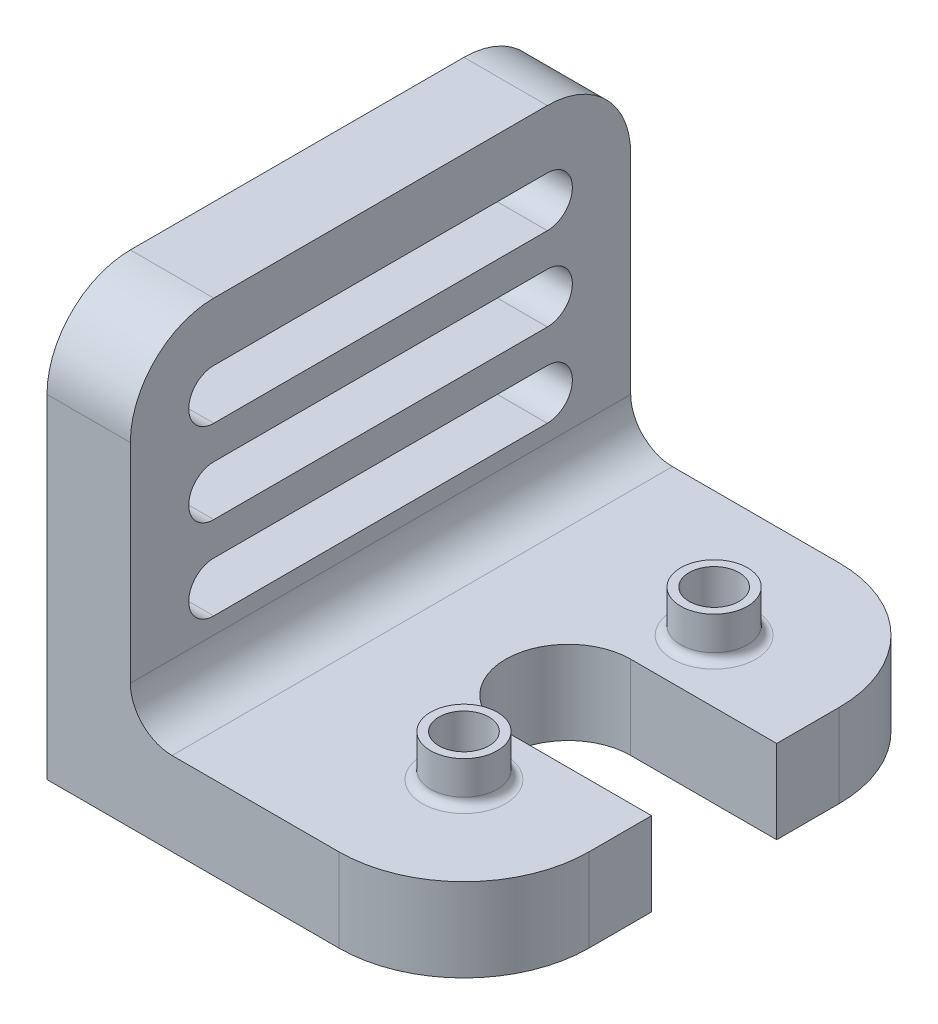
ISO-10303-21;
HEADER;
FILE_DESCRIPTION(('STEP AP214'),'2;1');
FILE_NAME('part.step','',(''),(''),'','','');
FILE_SCHEMA(('AUTOMOTIVE_DESIGN { 1 0 10303 214 1 1 1 1 }'));
ENDSEC;
DATA;
#1=APPLICATION_CONTEXT('core data for automotive mechanical design processes');
#2=APPLICATION_PROTOCOL_DEFINITION('international standard','automotive_design',2000,#1);
#3=PRODUCT_CONTEXT('',#1,'mechanical');
#4=PRODUCT('Part','Part','',(#3));
#5=PRODUCT_RELATED_PRODUCT_CATEGORY('part','',(#4));
#6=PRODUCT_DEFINITION_FORMATION('','',#4);
#7=PRODUCT_DEFINITION_CONTEXT('part definition',#1,'design');
#8=PRODUCT_DEFINITION('design','',#6,#7);
#9=PRODUCT_DEFINITION_SHAPE('','',#8);
#10=(LENGTH_UNIT() NAMED_UNIT(*) SI_UNIT(.MILLI.,.METRE.));
#11=(NAMED_UNIT(*) PLANE_ANGLE_UNIT() SI_UNIT($,.RADIAN.));
#12=(NAMED_UNIT(*) SI_UNIT($,.STERADIAN.) SOLID_ANGLE_UNIT());
#13=UNCERTAINTY_MEASURE_WITH_UNIT(LENGTH_MEASURE(1.E-05),#10,'distance_accuracy_value','');
#14=(GEOMETRIC_REPRESENTATION_CONTEXT(3) GLOBAL_UNCERTAINTY_ASSIGNED_CONTEXT((#13)) GLOBAL_UNIT_ASSIGNED_CONTEXT((#10,
#11,#12)) REPRESENTATION_CONTEXT('',''));
#15=CARTESIAN_POINT('',(0.,0.,0.));
#16=DIRECTION('',(0.,0.,1.));
#17=DIRECTION('',(1.,0.,0.));
#18=AXIS2_PLACEMENT_3D('',#15,#16,#17);
#19=CARTESIAN_POINT('',(100.,0.,60.));
#20=DIRECTION('',(-1.,0.,0.));
#21=DIRECTION('',(0.,0.,1.));
#22=AXIS2_PLACEMENT_3D('',#19,#20,#21);
#23=PLANE('',#22);
#24=DIRECTION('',(0.,1.,0.));
#25=VECTOR('',#24,1.);
#26=CARTESIAN_POINT('',(100.,-0.001000000000001,15.));
#27=LINE('',#26,#25);
#28=CARTESIAN_POINT('',(100.,0.,15.));
#29=VERTEX_POINT('',#28);
#30=CARTESIAN_POINT('',(100.,20.,15.));
#31=VERTEX_POINT('',#30);
#32=EDGE_CURVE('E250',#29,#31,#27,.T.);
#33=ORIENTED_EDGE('',*,*,#32,.T.);
#34=DIRECTION('',(0.,0.,-1.));
#35=VECTOR('',#34,1.);
#36=CARTESIAN_POINT('',(100.,20.,60.));
#37=LINE('',#36,#35);
#38=CARTESIAN_POINT('',(100.,20.,30.));
#39=VERTEX_POINT('',#38);
#40=EDGE_CURVE('E372',#39,#31,#37,.T.);
#41=ORIENTED_EDGE('',*,*,#40,.F.);
#42=DIRECTION('',(0.,1.,0.));
#43=VECTOR('',#42,1.);
#44=CARTESIAN_POINT('',(100.,0.,30.));
#45=LINE('',#44,#43);
#46=CARTESIAN_POINT('',(100.,0.,30.));
#47=VERTEX_POINT('',#46);
#48=EDGE_CURVE('E401',#39,#47,#45,.F.);
#49=ORIENTED_EDGE('',*,*,#48,.T.);
#50=DIRECTION('',(0.,0.,-1.));
#51=VECTOR('',#50,1.);
#52=CARTESIAN_POINT('',(100.,0.,60.));
#53=LINE('',#52,#51);
#54=EDGE_CURVE('E375',#47,#29,#53,.T.);
#55=ORIENTED_EDGE('',*,*,#54,.T.);
#56=EDGE_LOOP('',(#33,#41,#49,#55));
#57=FACE_BOUND('',#56,.T.);
#58=ADVANCED_FACE('F37',(#57),#23,.F.);
#59=CARTESIAN_POINT('',(0.,100.,60.));
#60=DIRECTION('',(1.,0.,0.));
#61=DIRECTION('',(0.,1.,0.));
#62=AXIS2_PLACEMENT_3D('',#59,#60,#61);
#63=PLANE('',#62);
#64=DIRECTION('',(0.,0.,-1.));
#65=VECTOR('',#64,1.);
#66=CARTESIAN_POINT('',(0.,86.,40.));
#67=LINE('',#66,#65);
#68=CARTESIAN_POINT('',(0.,86.,40.));
#69=VERTEX_POINT('',#68);
#70=CARTESIAN_POINT('',(0.,86.,-40.));
#71=VERTEX_POINT('',#70);
#72=EDGE_CURVE('E255',#69,#71,#67,.T.);
#73=ORIENTED_EDGE('',*,*,#72,.F.);
#74=CARTESIAN_POINT('',(0.,80.,40.));
#75=DIRECTION('',(1.,0.,0.));
#76=DIRECTION('',(0.,1.,0.));
#77=AXIS2_PLACEMENT_3D('',#74,#75,#76);
#78=CIRCLE('',#77,6.00000000000001);
#79=CARTESIAN_POINT('',(0.,74.,40.));
#80=VERTEX_POINT('',#79);
#81=EDGE_CURVE('E259',#80,#69,#78,.F.);
#82=ORIENTED_EDGE('',*,*,#81,.F.);
#83=DIRECTION('',(0.,0.,1.));
#84=VECTOR('',#83,1.);
#85=CARTESIAN_POINT('',(0.,74.,40.));
#86=LINE('',#85,#84);
#87=CARTESIAN_POINT('',(0.,74.,-40.));
#88=VERTEX_POINT('',#87);
#89=EDGE_CURVE('E276',#88,#80,#86,.T.);
#90=ORIENTED_EDGE('',*,*,#89,.F.);
#91=CARTESIAN_POINT('',(0.,80.,-40.));
#92=DIRECTION('',(1.,0.,0.));
#93=DIRECTION('',(0.,1.,0.));
#94=AXIS2_PLACEMENT_3D('',#91,#92,#93);
#95=CIRCLE('',#94,6.00000000000001);
#96=EDGE_CURVE('E60',#71,#88,#95,.F.);
#97=ORIENTED_EDGE('',*,*,#96,.F.);
#98=EDGE_LOOP('',(#73,#82,#90,#97));
#99=FACE_BOUND('',#98,.T.);
#100=DIRECTION('',(0.,0.,-1.));
#101=VECTOR('',#100,1.);
#102=CARTESIAN_POINT('',(0.,66.,40.));
#103=LINE('',#102,#101);
#104=CARTESIAN_POINT('',(0.,66.,40.));
#105=VERTEX_POINT('',#104);
#106=CARTESIAN_POINT('',(0.,66.,-40.));
#107=VERTEX_POINT('',#106);
#108=EDGE_CURVE('E313',#105,#107,#103,.T.);
#109=ORIENTED_EDGE('',*,*,#108,.F.);
#110=CARTESIAN_POINT('',(0.,60.,40.));
#111=DIRECTION('',(1.,0.,0.));
#112=DIRECTION('',(0.,1.,0.));
#113=AXIS2_PLACEMENT_3D('',#110,#111,#112);
#114=CIRCLE('',#113,6.00000000000001);
#115=CARTESIAN_POINT('',(0.,54.,40.));
#116=VERTEX_POINT('',#115);
#117=EDGE_CURVE('E310',#116,#105,#114,.F.);
#118=ORIENTED_EDGE('',*,*,#117,.F.);
#119=DIRECTION('',(0.,0.,1.));
#120=VECTOR('',#119,1.);
#121=CARTESIAN_POINT('',(0.,54.,40.));
#122=LINE('',#121,#120);
#123=CARTESIAN_POINT('',(0.,54.,-40.));
#124=VERTEX_POINT('',#123);
#125=EDGE_CURVE('E286',#124,#116,#122,.T.);
#126=ORIENTED_EDGE('',*,*,#125,.F.);
#127=CARTESIAN_POINT('',(0.,60.,-40.));
#128=DIRECTION('',(1.,0.,0.));
#129=DIRECTION('',(0.,1.,0.));
#130=AXIS2_PLACEMENT_3D('',#127,#128,#129);
#131=CIRCLE('',#130,6.00000000000001);
#132=EDGE_CURVE('E256',#107,#124,#131,.F.);
#133=ORIENTED_EDGE('',*,*,#132,.F.);
#134=EDGE_LOOP('',(#109,#118,#126,#133));
#135=FACE_BOUND('',#134,.T.);
#136=DIRECTION('',(0.,0.,-1.));
#137=VECTOR('',#136,1.);
#138=CARTESIAN_POINT('',(0.,46.,40.));
#139=LINE('',#138,#137);
#140=CARTESIAN_POINT('',(0.,46.,40.));
#141=VERTEX_POINT('',#140);
#142=CARTESIAN_POINT('',(0.,46.,-40.));
#143=VERTEX_POINT('',#142);
#144=EDGE_CURVE('E342',#141,#143,#139,.T.);
#145=ORIENTED_EDGE('',*,*,#144,.F.);
#146=CARTESIAN_POINT('',(0.,40.,40.));
#147=DIRECTION('',(1.,0.,0.));
#148=DIRECTION('',(0.,1.,0.));
#149=AXIS2_PLACEMENT_3D('',#146,#147,#148);
#150=CIRCLE('',#149,6.);
#151=CARTESIAN_POINT('',(0.,34.,40.));
#152=VERTEX_POINT('',#151);
#153=EDGE_CURVE('E339',#152,#141,#150,.F.);
#154=ORIENTED_EDGE('',*,*,#153,.F.);
#155=DIRECTION('',(0.,0.,1.));
#156=VECTOR('',#155,1.);
#157=CARTESIAN_POINT('',(0.,34.,40.));
#158=LINE('',#157,#156);
#159=CARTESIAN_POINT('',(0.,34.,-40.));
#160=VERTEX_POINT('',#159);
#161=EDGE_CURVE('E231',#160,#152,#158,.T.);
#162=ORIENTED_EDGE('',*,*,#161,.F.);
#163=CARTESIAN_POINT('',(0.,40.,-40.));
#164=DIRECTION('',(1.,0.,0.));
#165=DIRECTION('',(0.,1.,0.));
#166=AXIS2_PLACEMENT_3D('',#163,#164,#165);
#167=CIRCLE('',#166,6.);
#168=EDGE_CURVE('E290',#143,#160,#167,.F.);
#169=ORIENTED_EDGE('',*,*,#168,.F.);
#170=EDGE_LOOP('',(#145,#154,#162,#169));
#171=FACE_BOUND('',#170,.T.);
#172=DIRECTION('',(0.,0.,-1.));
#173=VECTOR('',#172,1.);
#174=CARTESIAN_POINT('',(0.,100.,60.));
#175=LINE('',#174,#173);
#176=CARTESIAN_POINT('',(0.,100.,40.));
#177=VERTEX_POINT('',#176);
#178=CARTESIAN_POINT('',(0.,100.,-40.));
#179=VERTEX_POINT('',#178);
#180=EDGE_CURVE('E357',#177,#179,#175,.T.);
#181=ORIENTED_EDGE('',*,*,#180,.T.);
#182=CARTESIAN_POINT('',(0.,80.,-40.));
#183=DIRECTION('',(1.,0.,0.));
#184=DIRECTION('',(0.,1.,0.));
#185=AXIS2_PLACEMENT_3D('',#182,#183,#184);
#186=CIRCLE('',#185,20.);
#187=CARTESIAN_POINT('',(0.,80.,-60.));
#188=VERTEX_POINT('',#187);
#189=EDGE_CURVE('E388',#179,#188,#186,.F.);
#190=ORIENTED_EDGE('',*,*,#189,.T.);
#191=DIRECTION('',(0.,-1.,0.));
#192=VECTOR('',#191,1.);
#193=CARTESIAN_POINT('',(0.,100.,-60.));
#194=LINE('',#193,#192);
#195=CARTESIAN_POINT('',(0.,0.,-60.));
#196=VERTEX_POINT('',#195);
#197=EDGE_CURVE('E285',#188,#196,#194,.T.);
#198=ORIENTED_EDGE('',*,*,#197,.T.);
#199=DIRECTION('',(0.,0.,-1.));
#200=VECTOR('',#199,1.);
#201=CARTESIAN_POINT('',(0.,0.,60.));
#202=LINE('',#201,#200);
#203=CARTESIAN_POINT('',(0.,0.,60.));
#204=VERTEX_POINT('',#203);
#205=EDGE_CURVE('E378',#204,#196,#202,.T.);
#206=ORIENTED_EDGE('',*,*,#205,.F.);
#207=DIRECTION('',(0.,-1.,0.));
#208=VECTOR('',#207,1.);
#209=CARTESIAN_POINT('',(0.,100.,60.));
#210=LINE('',#209,#208);
#211=CARTESIAN_POINT('',(0.,80.,60.));
#212=VERTEX_POINT('',#211);
#213=EDGE_CURVE('E346',#212,#204,#210,.T.);
#214=ORIENTED_EDGE('',*,*,#213,.F.);
#215=CARTESIAN_POINT('',(0.,80.,40.));
#216=DIRECTION('',(1.,0.,0.));
#217=DIRECTION('',(0.,1.,0.));
#218=AXIS2_PLACEMENT_3D('',#215,#216,#217);
#219=CIRCLE('',#218,20.);
#220=EDGE_CURVE('E386',#212,#177,#219,.F.);
#221=ORIENTED_EDGE('',*,*,#220,.T.);
#222=EDGE_LOOP('',(#181,#190,#198,#206,#214,#221));
#223=FACE_BOUND('',#222,.T.);
#224=ADVANCED_FACE('F493',(#99,#135,#171,#223),#63,.F.);
#225=CARTESIAN_POINT('',(0.,0.,60.));
#226=DIRECTION('',(0.,1.,0.));
#227=DIRECTION('',(0.,0.,1.));
#228=AXIS2_PLACEMENT_3D('',#225,#226,#227);
#229=PLANE('',#228);
#230=CARTESIAN_POINT('',(100.,0.,-15.));
#231=VERTEX_POINT('',#230);
#232=CARTESIAN_POINT('',(100.,0.,-30.));
#233=VERTEX_POINT('',#232);
#234=EDGE_CURVE('E237',#231,#233,#53,.T.);
#235=ORIENTED_EDGE('',*,*,#234,.F.);
#236=DIRECTION('',(1.,0.,0.));
#237=VECTOR('',#236,1.);
#238=CARTESIAN_POINT('',(0.,0.,-15.));
#239=LINE('',#238,#237);
#240=CARTESIAN_POINT('',(65.,0.,-15.));
#241=VERTEX_POINT('',#240);
#242=EDGE_CURVE('E217',#241,#231,#239,.T.);
#243=ORIENTED_EDGE('',*,*,#242,.F.);
#244=CARTESIAN_POINT('',(65.,0.,0.));
#245=DIRECTION('',(0.,1.,0.));
#246=DIRECTION('',(0.,0.,1.));
#247=AXIS2_PLACEMENT_3D('',#244,#245,#246);
#248=CIRCLE('',#247,15.);
#249=CARTESIAN_POINT('',(65.,0.,15.));
#250=VERTEX_POINT('',#249);
#251=EDGE_CURVE('E226',#250,#241,#248,.F.);
#252=ORIENTED_EDGE('',*,*,#251,.F.);
#253=DIRECTION('',(1.,0.,0.));
#254=VECTOR('',#253,1.);
#255=CARTESIAN_POINT('',(0.,0.,15.));
#256=LINE('',#255,#254);
#257=EDGE_CURVE('E238',#250,#29,#256,.T.);
#258=ORIENTED_EDGE('',*,*,#257,.T.);
#259=ORIENTED_EDGE('',*,*,#54,.F.);
#260=CARTESIAN_POINT('',(70.,0.,30.));
#261=DIRECTION('',(0.,1.,0.));
#262=DIRECTION('',(0.,0.,1.));
#263=AXIS2_PLACEMENT_3D('',#260,#261,#262);
#264=CIRCLE('',#263,30.);
#265=CARTESIAN_POINT('',(70.,0.,60.));
#266=VERTEX_POINT('',#265);
#267=EDGE_CURVE('E412',#47,#266,#264,.F.);
#268=ORIENTED_EDGE('',*,*,#267,.T.);
#269=DIRECTION('',(1.,0.,0.));
#270=VECTOR('',#269,1.);
#271=CARTESIAN_POINT('',(0.,0.,60.));
#272=LINE('',#271,#270);
#273=EDGE_CURVE('E348',#204,#266,#272,.T.);
#274=ORIENTED_EDGE('',*,*,#273,.F.);
#275=ORIENTED_EDGE('',*,*,#205,.T.);
#276=DIRECTION('',(1.,0.,0.));
#277=VECTOR('',#276,1.);
#278=CARTESIAN_POINT('',(0.,0.,-60.));
#279=LINE('',#278,#277);
#280=CARTESIAN_POINT('',(70.,0.,-60.));
#281=VERTEX_POINT('',#280);
#282=EDGE_CURVE('E359',#196,#281,#279,.T.);
#283=ORIENTED_EDGE('',*,*,#282,.T.);
#284=CARTESIAN_POINT('',(70.,0.,-30.));
#285=DIRECTION('',(0.,1.,0.));
#286=DIRECTION('',(0.,0.,1.));
#287=AXIS2_PLACEMENT_3D('',#284,#285,#286);
#288=CIRCLE('',#287,30.);
#289=EDGE_CURVE('E414',#281,#233,#288,.F.);
#290=ORIENTED_EDGE('',*,*,#289,.T.);
#291=EDGE_LOOP('',(#235,#243,#252,#258,#259,#268,#274,#275,#283,#290));
#292=FACE_BOUND('',#291,.T.);
#293=ADVANCED_FACE('F235',(#292),#229,.F.);
#294=CARTESIAN_POINT('',(100.,20.,-15.));
#295=VERTEX_POINT('',#294);
#296=CARTESIAN_POINT('',(100.,20.,-30.));
#297=VERTEX_POINT('',#296);
#298=EDGE_CURVE('E371',#295,#297,#37,.T.);
#299=ORIENTED_EDGE('',*,*,#298,.F.);
#300=DIRECTION('',(0.,1.,0.));
#301=VECTOR('',#300,1.);
#302=CARTESIAN_POINT('',(100.,-0.001000000000001,-15.));
#303=LINE('',#302,#301);
#304=EDGE_CURVE('E232',#231,#295,#303,.T.);
#305=ORIENTED_EDGE('',*,*,#304,.F.);
#306=ORIENTED_EDGE('',*,*,#234,.T.);
#307=DIRECTION('',(0.,1.,0.));
#308=VECTOR('',#307,1.);
#309=CARTESIAN_POINT('',(100.,0.,-30.));
#310=LINE('',#309,#308);
#311=EDGE_CURVE('E403',#233,#297,#310,.T.);
#312=ORIENTED_EDGE('',*,*,#311,.T.);
#313=EDGE_LOOP('',(#299,#305,#306,#312));
#314=FACE_BOUND('',#313,.T.);
#315=ADVANCED_FACE('F496',(#314),#23,.F.);
#316=CARTESIAN_POINT('',(100.,20.,60.));
#317=DIRECTION('',(0.,-1.,0.));
#318=DIRECTION('',(1.,0.,0.));
#319=AXIS2_PLACEMENT_3D('',#316,#317,#318);
#320=PLANE('',#319);
#321=CARTESIAN_POINT('',(70.,20.,30.));
#322=DIRECTION('',(0.,-1.,0.));
#323=DIRECTION('',(1.,0.,0.));
#324=AXIS2_PLACEMENT_3D('',#321,#322,#323);
#325=CIRCLE('',#324,10.);
#326=CARTESIAN_POINT('',(80.,20.,30.));
#327=VERTEX_POINT('',#326);
#328=EDGE_CURVE('E45',#327,#327,#325,.T.);
#329=ORIENTED_EDGE('',*,*,#328,.T.);
#330=EDGE_LOOP('',(#329));
#331=FACE_BOUND('',#330,.T.);
#332=CARTESIAN_POINT('',(70.,20.,-30.));
#333=DIRECTION('',(0.,-1.,0.));
#334=DIRECTION('',(1.,0.,0.));
#335=AXIS2_PLACEMENT_3D('',#332,#333,#334);
#336=CIRCLE('',#335,10.);
#337=CARTESIAN_POINT('',(80.,20.,-30.));
#338=VERTEX_POINT('',#337);
#339=EDGE_CURVE('E431',#338,#338,#336,.T.);
#340=ORIENTED_EDGE('',*,*,#339,.T.);
#341=EDGE_LOOP('',(#340));
#342=FACE_BOUND('',#341,.T.);
#343=CARTESIAN_POINT('',(65.,20.,0.));
#344=DIRECTION('',(0.,1.,0.));
#345=DIRECTION('',(-1.,0.,0.));
#346=AXIS2_PLACEMENT_3D('',#343,#344,#345);
#347=CIRCLE('',#346,15.);
#348=CARTESIAN_POINT('',(65.,20.,-15.));
#349=VERTEX_POINT('',#348);
#350=CARTESIAN_POINT('',(65.,20.,15.));
#351=VERTEX_POINT('',#350);
#352=EDGE_CURVE('E240',#349,#351,#347,.T.);
#353=ORIENTED_EDGE('',*,*,#352,.F.);
#354=DIRECTION('',(-1.,0.,0.));
#355=VECTOR('',#354,1.);
#356=CARTESIAN_POINT('',(0.,20.,-15.));
#357=LINE('',#356,#355);
#358=EDGE_CURVE('E52',#295,#349,#357,.T.);
#359=ORIENTED_EDGE('',*,*,#358,.F.);
#360=ORIENTED_EDGE('',*,*,#298,.T.);
#361=CARTESIAN_POINT('',(70.,20.,-30.));
#362=DIRECTION('',(0.,-1.,0.));
#363=DIRECTION('',(1.,0.,0.));
#364=AXIS2_PLACEMENT_3D('',#361,#362,#363);
#365=CIRCLE('',#364,30.);
#366=CARTESIAN_POINT('',(70.,20.,-60.));
#367=VERTEX_POINT('',#366);
#368=EDGE_CURVE('E408',#297,#367,#365,.F.);
#369=ORIENTED_EDGE('',*,*,#368,.T.);
#370=DIRECTION('',(-1.,0.,0.));
#371=VECTOR('',#370,1.);
#372=CARTESIAN_POINT('',(100.,20.,-60.));
#373=LINE('',#372,#371);
#374=CARTESIAN_POINT('',(30.,20.,-60.));
#375=VERTEX_POINT('',#374);
#376=EDGE_CURVE('E362',#367,#375,#373,.T.);
#377=ORIENTED_EDGE('',*,*,#376,.T.);
#378=DIRECTION('',(0.,0.,-1.));
#379=VECTOR('',#378,1.);
#380=CARTESIAN_POINT('',(30.,20.,60.));
#381=LINE('',#380,#379);
#382=CARTESIAN_POINT('',(30.,20.,60.));
#383=VERTEX_POINT('',#382);
#384=EDGE_CURVE('E422',#375,#383,#381,.F.);
#385=ORIENTED_EDGE('',*,*,#384,.T.);
#386=DIRECTION('',(-1.,0.,0.));
#387=VECTOR('',#386,1.);
#388=CARTESIAN_POINT('',(100.,20.,60.));
#389=LINE('',#388,#387);
#390=CARTESIAN_POINT('',(70.,20.,60.));
#391=VERTEX_POINT('',#390);
#392=EDGE_CURVE('E352',#391,#383,#389,.T.);
#393=ORIENTED_EDGE('',*,*,#392,.F.);
#394=CARTESIAN_POINT('',(70.,20.,30.));
#395=DIRECTION('',(0.,-1.,0.));
#396=DIRECTION('',(1.,0.,0.));
#397=AXIS2_PLACEMENT_3D('',#394,#395,#396);
#398=CIRCLE('',#397,30.);
#399=EDGE_CURVE('E406',#391,#39,#398,.F.);
#400=ORIENTED_EDGE('',*,*,#399,.T.);
#401=ORIENTED_EDGE('',*,*,#40,.T.);
#402=DIRECTION('',(-1.,0.,0.));
#403=VECTOR('',#402,1.);
#404=CARTESIAN_POINT('',(0.,20.,15.));
#405=LINE('',#404,#403);
#406=EDGE_CURVE('E223',#31,#351,#405,.T.);
#407=ORIENTED_EDGE('',*,*,#406,.T.);
#408=EDGE_LOOP('',(#353,#359,#360,#369,#377,#385,#393,#400,#401,#407));
#409=FACE_BOUND('',#408,.T.);
#410=ADVANCED_FACE('F436',(#331,#342,#409),#320,.F.);
#411=CARTESIAN_POINT('',(20.,20.,60.));
#412=DIRECTION('',(-1.,0.,0.));
#413=DIRECTION('',(0.,-1.,0.));
#414=AXIS2_PLACEMENT_3D('',#411,#412,#413);
#415=PLANE('',#414);
#416=DIRECTION('',(0.,0.,-1.));
#417=VECTOR('',#416,1.);
#418=CARTESIAN_POINT('',(20.,74.,40.));
#419=LINE('',#418,#417);
#420=CARTESIAN_POINT('',(20.,74.,40.));
#421=VERTEX_POINT('',#420);
#422=CARTESIAN_POINT('',(20.,74.,-40.));
#423=VERTEX_POINT('',#422);
#424=EDGE_CURVE('E264',#421,#423,#419,.T.);
#425=ORIENTED_EDGE('',*,*,#424,.F.);
#426=CARTESIAN_POINT('',(20.,80.,40.));
#427=DIRECTION('',(1.,0.,0.));
#428=DIRECTION('',(0.,1.,0.));
#429=AXIS2_PLACEMENT_3D('',#426,#427,#428);
#430=CIRCLE('',#429,6.00000000000001);
#431=CARTESIAN_POINT('',(20.,86.,40.));
#432=VERTEX_POINT('',#431);
#433=EDGE_CURVE('E262',#432,#421,#430,.T.);
#434=ORIENTED_EDGE('',*,*,#433,.F.);
#435=DIRECTION('',(0.,0.,1.));
#436=VECTOR('',#435,1.);
#437=CARTESIAN_POINT('',(20.,86.,40.));
#438=LINE('',#437,#436);
#439=CARTESIAN_POINT('',(20.,86.,-40.));
#440=VERTEX_POINT('',#439);
#441=EDGE_CURVE('E270',#440,#432,#438,.T.);
#442=ORIENTED_EDGE('',*,*,#441,.F.);
#443=CARTESIAN_POINT('',(20.,80.,-40.));
#444=DIRECTION('',(1.,0.,0.));
#445=DIRECTION('',(0.,1.,0.));
#446=AXIS2_PLACEMENT_3D('',#443,#444,#445);
#447=CIRCLE('',#446,6.00000000000001);
#448=EDGE_CURVE('E267',#423,#440,#447,.T.);
#449=ORIENTED_EDGE('',*,*,#448,.F.);
#450=EDGE_LOOP('',(#425,#434,#442,#449));
#451=FACE_BOUND('',#450,.T.);
#452=DIRECTION('',(0.,0.,-1.));
#453=VECTOR('',#452,1.);
#454=CARTESIAN_POINT('',(20.,54.,40.));
#455=LINE('',#454,#453);
#456=CARTESIAN_POINT('',(20.,54.,40.));
#457=VERTEX_POINT('',#456);
#458=CARTESIAN_POINT('',(20.,54.,-40.));
#459=VERTEX_POINT('',#458);
#460=EDGE_CURVE('E305',#457,#459,#455,.T.);
#461=ORIENTED_EDGE('',*,*,#460,.F.);
#462=CARTESIAN_POINT('',(20.,60.,40.));
#463=DIRECTION('',(1.,0.,0.));
#464=DIRECTION('',(0.,1.,0.));
#465=AXIS2_PLACEMENT_3D('',#462,#463,#464);
#466=CIRCLE('',#465,6.00000000000001);
#467=CARTESIAN_POINT('',(20.,66.,40.));
#468=VERTEX_POINT('',#467);
#469=EDGE_CURVE('E308',#468,#457,#466,.T.);
#470=ORIENTED_EDGE('',*,*,#469,.F.);
#471=DIRECTION('',(0.,0.,1.));
#472=VECTOR('',#471,1.);
#473=CARTESIAN_POINT('',(20.,66.,40.));
#474=LINE('',#473,#472);
#475=CARTESIAN_POINT('',(20.,66.,-40.));
#476=VERTEX_POINT('',#475);
#477=EDGE_CURVE('E294',#476,#468,#474,.T.);
#478=ORIENTED_EDGE('',*,*,#477,.F.);
#479=CARTESIAN_POINT('',(20.,60.,-40.));
#480=DIRECTION('',(1.,0.,0.));
#481=DIRECTION('',(0.,1.,0.));
#482=AXIS2_PLACEMENT_3D('',#479,#480,#481);
#483=CIRCLE('',#482,6.00000000000001);
#484=EDGE_CURVE('E302',#459,#476,#483,.T.);
#485=ORIENTED_EDGE('',*,*,#484,.F.);
#486=EDGE_LOOP('',(#461,#470,#478,#485));
#487=FACE_BOUND('',#486,.T.);
#488=DIRECTION('',(0.,0.,-1.));
#489=VECTOR('',#488,1.);
#490=CARTESIAN_POINT('',(20.,34.,40.));
#491=LINE('',#490,#489);
#492=CARTESIAN_POINT('',(20.,34.,40.));
#493=VERTEX_POINT('',#492);
#494=CARTESIAN_POINT('',(20.,34.,-40.));
#495=VERTEX_POINT('',#494);
#496=EDGE_CURVE('E334',#493,#495,#491,.T.);
#497=ORIENTED_EDGE('',*,*,#496,.F.);
#498=CARTESIAN_POINT('',(20.,40.,40.));
#499=DIRECTION('',(1.,0.,0.));
#500=DIRECTION('',(0.,1.,0.));
#501=AXIS2_PLACEMENT_3D('',#498,#499,#500);
#502=CIRCLE('',#501,6.);
#503=CARTESIAN_POINT('',(20.,46.,40.));
#504=VERTEX_POINT('',#503);
#505=EDGE_CURVE('E337',#504,#493,#502,.T.);
#506=ORIENTED_EDGE('',*,*,#505,.F.);
#507=DIRECTION('',(0.,0.,1.));
#508=VECTOR('',#507,1.);
#509=CARTESIAN_POINT('',(20.,46.,40.));
#510=LINE('',#509,#508);
#511=CARTESIAN_POINT('',(20.,46.,-40.));
#512=VERTEX_POINT('',#511);
#513=EDGE_CURVE('E323',#512,#504,#510,.T.);
#514=ORIENTED_EDGE('',*,*,#513,.F.);
#515=CARTESIAN_POINT('',(20.,40.,-40.));
#516=DIRECTION('',(1.,0.,0.));
#517=DIRECTION('',(0.,1.,0.));
#518=AXIS2_PLACEMENT_3D('',#515,#516,#517);
#519=CIRCLE('',#518,6.);
#520=EDGE_CURVE('E331',#495,#512,#519,.T.);
#521=ORIENTED_EDGE('',*,*,#520,.F.);
#522=EDGE_LOOP('',(#497,#506,#514,#521));
#523=FACE_BOUND('',#522,.T.);
#524=DIRECTION('',(0.,1.,0.));
#525=VECTOR('',#524,1.);
#526=CARTESIAN_POINT('',(20.,20.,60.));
#527=LINE('',#526,#525);
#528=CARTESIAN_POINT('',(20.,30.,60.));
#529=VERTEX_POINT('',#528);
#530=CARTESIAN_POINT('',(20.,80.,60.));
#531=VERTEX_POINT('',#530);
#532=EDGE_CURVE('E355',#529,#531,#527,.T.);
#533=ORIENTED_EDGE('',*,*,#532,.F.);
#534=DIRECTION('',(0.,0.,-1.));
#535=VECTOR('',#534,1.);
#536=CARTESIAN_POINT('',(20.,30.,-60.));
#537=LINE('',#536,#535);
#538=CARTESIAN_POINT('',(20.,30.,-60.));
#539=VERTEX_POINT('',#538);
#540=EDGE_CURVE('E419',#529,#539,#537,.T.);
#541=ORIENTED_EDGE('',*,*,#540,.T.);
#542=DIRECTION('',(0.,1.,0.));
#543=VECTOR('',#542,1.);
#544=CARTESIAN_POINT('',(20.,20.,-60.));
#545=LINE('',#544,#543);
#546=CARTESIAN_POINT('',(20.,80.,-60.));
#547=VERTEX_POINT('',#546);
#548=EDGE_CURVE('E349',#539,#547,#545,.T.);
#549=ORIENTED_EDGE('',*,*,#548,.T.);
#550=CARTESIAN_POINT('',(20.,80.,-40.));
#551=DIRECTION('',(-1.,0.,0.));
#552=DIRECTION('',(0.,-1.,0.));
#553=AXIS2_PLACEMENT_3D('',#550,#551,#552);
#554=CIRCLE('',#553,20.);
#555=CARTESIAN_POINT('',(20.,100.,-40.));
#556=VERTEX_POINT('',#555);
#557=EDGE_CURVE('E396',#547,#556,#554,.F.);
#558=ORIENTED_EDGE('',*,*,#557,.T.);
#559=DIRECTION('',(0.,0.,-1.));
#560=VECTOR('',#559,1.);
#561=CARTESIAN_POINT('',(20.,100.,60.));
#562=LINE('',#561,#560);
#563=CARTESIAN_POINT('',(20.,100.,40.));
#564=VERTEX_POINT('',#563);
#565=EDGE_CURVE('E368',#564,#556,#562,.T.);
#566=ORIENTED_EDGE('',*,*,#565,.F.);
#567=CARTESIAN_POINT('',(20.,80.,40.));
#568=DIRECTION('',(-1.,0.,0.));
#569=DIRECTION('',(0.,-1.,0.));
#570=AXIS2_PLACEMENT_3D('',#567,#568,#569);
#571=CIRCLE('',#570,20.);
#572=EDGE_CURVE('E393',#564,#531,#571,.F.);
#573=ORIENTED_EDGE('',*,*,#572,.T.);
#574=EDGE_LOOP('',(#533,#541,#549,#558,#566,#573));
#575=FACE_BOUND('',#574,.T.);
#576=ADVANCED_FACE('F511',(#451,#487,#523,#575),#415,.F.);
#577=CARTESIAN_POINT('',(20.,100.,60.));
#578=DIRECTION('',(0.,-1.,0.));
#579=DIRECTION('',(0.,0.,-1.));
#580=AXIS2_PLACEMENT_3D('',#577,#578,#579);
#581=PLANE('',#580);
#582=ORIENTED_EDGE('',*,*,#565,.T.);
#583=DIRECTION('',(-1.,0.,0.));
#584=VECTOR('',#583,1.);
#585=CARTESIAN_POINT('',(20.,100.,-40.));
#586=LINE('',#585,#584);
#587=EDGE_CURVE('E383',#556,#179,#586,.T.);
#588=ORIENTED_EDGE('',*,*,#587,.T.);
#589=ORIENTED_EDGE('',*,*,#180,.F.);
#590=DIRECTION('',(-1.,0.,0.));
#591=VECTOR('',#590,1.);
#592=CARTESIAN_POINT('',(20.,100.,40.));
#593=LINE('',#592,#591);
#594=EDGE_CURVE('E381',#177,#564,#593,.F.);
#595=ORIENTED_EDGE('',*,*,#594,.T.);
#596=EDGE_LOOP('',(#582,#588,#589,#595));
#597=FACE_BOUND('',#596,.T.);
#598=ADVANCED_FACE('F540',(#597),#581,.F.);
#599=CARTESIAN_POINT('',(0.,0.,60.));
#600=DIRECTION('',(0.,0.,1.));
#601=DIRECTION('',(1.,0.,0.));
#602=AXIS2_PLACEMENT_3D('',#599,#600,#601);
#603=PLANE('',#602);
#604=ORIENTED_EDGE('',*,*,#273,.T.);
#605=DIRECTION('',(0.,1.,0.));
#606=VECTOR('',#605,1.);
#607=CARTESIAN_POINT('',(70.,20.,60.));
#608=LINE('',#607,#606);
#609=EDGE_CURVE('E416',#266,#391,#608,.T.);
#610=ORIENTED_EDGE('',*,*,#609,.T.);
#611=ORIENTED_EDGE('',*,*,#392,.T.);
#612=CARTESIAN_POINT('',(30.,30.,60.));
#613=DIRECTION('',(0.,0.,1.));
#614=DIRECTION('',(1.,0.,0.));
#615=AXIS2_PLACEMENT_3D('',#612,#613,#614);
#616=CIRCLE('',#615,10.);
#617=EDGE_CURVE('E426',#383,#529,#616,.F.);
#618=ORIENTED_EDGE('',*,*,#617,.T.);
#619=ORIENTED_EDGE('',*,*,#532,.T.);
#620=DIRECTION('',(-1.,0.,0.));
#621=VECTOR('',#620,1.);
#622=CARTESIAN_POINT('',(0.,80.,60.));
#623=LINE('',#622,#621);
#624=EDGE_CURVE('E398',#531,#212,#623,.T.);
#625=ORIENTED_EDGE('',*,*,#624,.T.);
#626=ORIENTED_EDGE('',*,*,#213,.T.);
#627=EDGE_LOOP('',(#604,#610,#611,#618,#619,#625,#626));
#628=FACE_BOUND('',#627,.T.);
#629=ADVANCED_FACE('F553',(#628),#603,.T.);
#630=CARTESIAN_POINT('',(0.,0.,-60.));
#631=DIRECTION('',(0.,0.,1.));
#632=DIRECTION('',(1.,0.,0.));
#633=AXIS2_PLACEMENT_3D('',#630,#631,#632);
#634=PLANE('',#633);
#635=ORIENTED_EDGE('',*,*,#376,.F.);
#636=DIRECTION('',(0.,1.,0.));
#637=VECTOR('',#636,1.);
#638=CARTESIAN_POINT('',(70.,0.,-60.));
#639=LINE('',#638,#637);
#640=EDGE_CURVE('E410',#367,#281,#639,.F.);
#641=ORIENTED_EDGE('',*,*,#640,.T.);
#642=ORIENTED_EDGE('',*,*,#282,.F.);
#643=ORIENTED_EDGE('',*,*,#197,.F.);
#644=DIRECTION('',(-1.,0.,0.));
#645=VECTOR('',#644,1.);
#646=CARTESIAN_POINT('',(0.,80.,-60.));
#647=LINE('',#646,#645);
#648=EDGE_CURVE('E390',#188,#547,#647,.F.);
#649=ORIENTED_EDGE('',*,*,#648,.T.);
#650=ORIENTED_EDGE('',*,*,#548,.F.);
#651=CARTESIAN_POINT('',(30.,30.,-60.));
#652=DIRECTION('',(0.,0.,1.));
#653=DIRECTION('',(1.,0.,0.));
#654=AXIS2_PLACEMENT_3D('',#651,#652,#653);
#655=CIRCLE('',#654,10.);
#656=EDGE_CURVE('E424',#539,#375,#655,.T.);
#657=ORIENTED_EDGE('',*,*,#656,.T.);
#658=EDGE_LOOP('',(#635,#641,#642,#643,#649,#650,#657));
#659=FACE_BOUND('',#658,.T.);
#660=ADVANCED_FACE('F523',(#659),#634,.F.);
#661=CARTESIAN_POINT('',(20.,80.,-40.));
#662=DIRECTION('',(-1.,0.,0.));
#663=DIRECTION('',(0.,0.,1.));
#664=AXIS2_PLACEMENT_3D('',#661,#662,#663);
#665=CYLINDRICAL_SURFACE('',#664,20.);
#666=ORIENTED_EDGE('',*,*,#557,.F.);
#667=ORIENTED_EDGE('',*,*,#648,.F.);
#668=ORIENTED_EDGE('',*,*,#189,.F.);
#669=ORIENTED_EDGE('',*,*,#587,.F.);
#670=EDGE_LOOP('',(#666,#667,#668,#669));
#671=FACE_BOUND('',#670,.T.);
#672=ADVANCED_FACE('F533',(#671),#665,.T.);
#673=CARTESIAN_POINT('',(0.,80.,40.));
#674=DIRECTION('',(1.,0.,0.));
#675=DIRECTION('',(0.,0.,-1.));
#676=AXIS2_PLACEMENT_3D('',#673,#674,#675);
#677=CYLINDRICAL_SURFACE('',#676,20.);
#678=ORIENTED_EDGE('',*,*,#572,.F.);
#679=ORIENTED_EDGE('',*,*,#594,.F.);
#680=ORIENTED_EDGE('',*,*,#220,.F.);
#681=ORIENTED_EDGE('',*,*,#624,.F.);
#682=EDGE_LOOP('',(#678,#679,#680,#681));
#683=FACE_BOUND('',#682,.T.);
#684=ADVANCED_FACE('F544',(#683),#677,.T.);
#685=CARTESIAN_POINT('',(70.,0.,-30.));
#686=DIRECTION('',(0.,1.,0.));
#687=DIRECTION('',(0.,0.,1.));
#688=AXIS2_PLACEMENT_3D('',#685,#686,#687);
#689=CYLINDRICAL_SURFACE('',#688,30.);
#690=ORIENTED_EDGE('',*,*,#289,.F.);
#691=ORIENTED_EDGE('',*,*,#640,.F.);
#692=ORIENTED_EDGE('',*,*,#368,.F.);
#693=ORIENTED_EDGE('',*,*,#311,.F.);
#694=EDGE_LOOP('',(#690,#691,#692,#693));
#695=FACE_BOUND('',#694,.T.);
#696=ADVANCED_FACE('F520',(#695),#689,.T.);
#697=CARTESIAN_POINT('',(70.,0.,30.));
#698=DIRECTION('',(0.,-1.,0.));
#699=DIRECTION('',(0.,0.,-1.));
#700=AXIS2_PLACEMENT_3D('',#697,#698,#699);
#701=CYLINDRICAL_SURFACE('',#700,30.);
#702=ORIENTED_EDGE('',*,*,#267,.F.);
#703=ORIENTED_EDGE('',*,*,#48,.F.);
#704=ORIENTED_EDGE('',*,*,#399,.F.);
#705=ORIENTED_EDGE('',*,*,#609,.F.);
#706=EDGE_LOOP('',(#702,#703,#704,#705));
#707=FACE_BOUND('',#706,.T.);
#708=ADVANCED_FACE('F557',(#707),#701,.T.);
#709=CARTESIAN_POINT('',(30.,30.,60.));
#710=DIRECTION('',(0.,0.,1.));
#711=DIRECTION('',(1.,0.,0.));
#712=AXIS2_PLACEMENT_3D('',#709,#710,#711);
#713=CYLINDRICAL_SURFACE('',#712,10.);
#714=ORIENTED_EDGE('',*,*,#617,.F.);
#715=ORIENTED_EDGE('',*,*,#384,.F.);
#716=ORIENTED_EDGE('',*,*,#656,.F.);
#717=ORIENTED_EDGE('',*,*,#540,.F.);
#718=EDGE_LOOP('',(#714,#715,#716,#717));
#719=FACE_BOUND('',#718,.T.);
#720=ADVANCED_FACE('F550',(#719),#713,.F.);
#721=CARTESIAN_POINT('',(-0.001000000000001,40.,40.));
#722=DIRECTION('',(1.,0.,0.));
#723=DIRECTION('',(0.,1.,0.));
#724=AXIS2_PLACEMENT_3D('',#721,#722,#723);
#725=CYLINDRICAL_SURFACE('',#724,6.);
#726=ORIENTED_EDGE('',*,*,#153,.T.);
#727=DIRECTION('',(1.,0.,0.));
#728=VECTOR('',#727,1.);
#729=CARTESIAN_POINT('',(-0.00100000000000447,46.,40.));
#730=LINE('',#729,#728);
#731=EDGE_CURVE('E319',#141,#504,#730,.T.);
#732=ORIENTED_EDGE('',*,*,#731,.T.);
#733=ORIENTED_EDGE('',*,*,#505,.T.);
#734=DIRECTION('',(1.,0.,0.));
#735=VECTOR('',#734,1.);
#736=CARTESIAN_POINT('',(-0.001000000000001,34.,40.));
#737=LINE('',#736,#735);
#738=EDGE_CURVE('E320',#152,#493,#737,.T.);
#739=ORIENTED_EDGE('',*,*,#738,.F.);
#740=EDGE_LOOP('',(#726,#732,#733,#739));
#741=FACE_BOUND('',#740,.T.);
#742=ADVANCED_FACE('F605',(#741),#725,.F.);
#743=CARTESIAN_POINT('',(-0.00100000000000447,46.,40.));
#744=DIRECTION('',(0.,1.,0.));
#745=DIRECTION('',(-1.,0.,0.));
#746=AXIS2_PLACEMENT_3D('',#743,#744,#745);
#747=PLANE('',#746);
#748=ORIENTED_EDGE('',*,*,#144,.T.);
#749=DIRECTION('',(1.,0.,0.));
#750=VECTOR('',#749,1.);
#751=CARTESIAN_POINT('',(-0.00100000000000447,46.,-40.));
#752=LINE('',#751,#750);
#753=EDGE_CURVE('E326',#143,#512,#752,.T.);
#754=ORIENTED_EDGE('',*,*,#753,.T.);
#755=ORIENTED_EDGE('',*,*,#513,.T.);
#756=ORIENTED_EDGE('',*,*,#731,.F.);
#757=EDGE_LOOP('',(#748,#754,#755,#756));
#758=FACE_BOUND('',#757,.T.);
#759=ADVANCED_FACE('F608',(#758),#747,.F.);
#760=CARTESIAN_POINT('',(-0.001000000000001,40.,-40.));
#761=DIRECTION('',(1.,0.,0.));
#762=DIRECTION('',(0.,1.,0.));
#763=AXIS2_PLACEMENT_3D('',#760,#761,#762);
#764=CYLINDRICAL_SURFACE('',#763,6.);
#765=ORIENTED_EDGE('',*,*,#168,.T.);
#766=DIRECTION('',(1.,0.,0.));
#767=VECTOR('',#766,1.);
#768=CARTESIAN_POINT('',(-0.001000000000001,34.,-40.));
#769=LINE('',#768,#767);
#770=EDGE_CURVE('E324',#160,#495,#769,.T.);
#771=ORIENTED_EDGE('',*,*,#770,.T.);
#772=ORIENTED_EDGE('',*,*,#520,.T.);
#773=ORIENTED_EDGE('',*,*,#753,.F.);
#774=EDGE_LOOP('',(#765,#771,#772,#773));
#775=FACE_BOUND('',#774,.T.);
#776=ADVANCED_FACE('F612',(#775),#764,.F.);
#777=CARTESIAN_POINT('',(-0.001000000000001,34.,40.));
#778=DIRECTION('',(0.,-1.,0.));
#779=DIRECTION('',(1.,0.,0.));
#780=AXIS2_PLACEMENT_3D('',#777,#778,#779);
#781=PLANE('',#780);
#782=ORIENTED_EDGE('',*,*,#161,.T.);
#783=ORIENTED_EDGE('',*,*,#738,.T.);
#784=ORIENTED_EDGE('',*,*,#496,.T.);
#785=ORIENTED_EDGE('',*,*,#770,.F.);
#786=EDGE_LOOP('',(#782,#783,#784,#785));
#787=FACE_BOUND('',#786,.T.);
#788=ADVANCED_FACE('F593',(#787),#781,.F.);
#789=CARTESIAN_POINT('',(-0.00100000000000447,60.,40.));
#790=DIRECTION('',(1.,0.,0.));
#791=DIRECTION('',(0.,1.,0.));
#792=AXIS2_PLACEMENT_3D('',#789,#790,#791);
#793=CYLINDRICAL_SURFACE('',#792,6.00000000000001);
#794=ORIENTED_EDGE('',*,*,#117,.T.);
#795=DIRECTION('',(1.,0.,0.));
#796=VECTOR('',#795,1.);
#797=CARTESIAN_POINT('',(-0.00100000000000447,66.,40.));
#798=LINE('',#797,#796);
#799=EDGE_CURVE('E289',#105,#468,#798,.T.);
#800=ORIENTED_EDGE('',*,*,#799,.T.);
#801=ORIENTED_EDGE('',*,*,#469,.T.);
#802=DIRECTION('',(1.,0.,0.));
#803=VECTOR('',#802,1.);
#804=CARTESIAN_POINT('',(-0.00100000000000447,54.,40.));
#805=LINE('',#804,#803);
#806=EDGE_CURVE('E291',#116,#457,#805,.T.);
#807=ORIENTED_EDGE('',*,*,#806,.F.);
#808=EDGE_LOOP('',(#794,#800,#801,#807));
#809=FACE_BOUND('',#808,.T.);
#810=ADVANCED_FACE('F589',(#809),#793,.F.);
#811=CARTESIAN_POINT('',(-0.00100000000000447,66.,40.));
#812=DIRECTION('',(0.,1.,0.));
#813=DIRECTION('',(-1.,0.,0.));
#814=AXIS2_PLACEMENT_3D('',#811,#812,#813);
#815=PLANE('',#814);
#816=ORIENTED_EDGE('',*,*,#108,.T.);
#817=DIRECTION('',(1.,0.,0.));
#818=VECTOR('',#817,1.);
#819=CARTESIAN_POINT('',(-0.00100000000000447,66.,-40.));
#820=LINE('',#819,#818);
#821=EDGE_CURVE('E297',#107,#476,#820,.T.);
#822=ORIENTED_EDGE('',*,*,#821,.T.);
#823=ORIENTED_EDGE('',*,*,#477,.T.);
#824=ORIENTED_EDGE('',*,*,#799,.F.);
#825=EDGE_LOOP('',(#816,#822,#823,#824));
#826=FACE_BOUND('',#825,.T.);
#827=ADVANCED_FACE('F592',(#826),#815,.F.);
#828=CARTESIAN_POINT('',(-0.00100000000000447,60.,-40.));
#829=DIRECTION('',(1.,0.,0.));
#830=DIRECTION('',(0.,1.,0.));
#831=AXIS2_PLACEMENT_3D('',#828,#829,#830);
#832=CYLINDRICAL_SURFACE('',#831,6.00000000000001);
#833=ORIENTED_EDGE('',*,*,#132,.T.);
#834=DIRECTION('',(1.,0.,0.));
#835=VECTOR('',#834,1.);
#836=CARTESIAN_POINT('',(-0.00100000000000447,54.,-40.));
#837=LINE('',#836,#835);
#838=EDGE_CURVE('E295',#124,#459,#837,.T.);
#839=ORIENTED_EDGE('',*,*,#838,.T.);
#840=ORIENTED_EDGE('',*,*,#484,.T.);
#841=ORIENTED_EDGE('',*,*,#821,.F.);
#842=EDGE_LOOP('',(#833,#839,#840,#841));
#843=FACE_BOUND('',#842,.T.);
#844=ADVANCED_FACE('F597',(#843),#832,.F.);
#845=CARTESIAN_POINT('',(-0.00100000000000447,54.,40.));
#846=DIRECTION('',(0.,-1.,0.));
#847=DIRECTION('',(1.,0.,0.));
#848=AXIS2_PLACEMENT_3D('',#845,#846,#847);
#849=PLANE('',#848);
#850=ORIENTED_EDGE('',*,*,#125,.T.);
#851=ORIENTED_EDGE('',*,*,#806,.T.);
#852=ORIENTED_EDGE('',*,*,#460,.T.);
#853=ORIENTED_EDGE('',*,*,#838,.F.);
#854=EDGE_LOOP('',(#850,#851,#852,#853));
#855=FACE_BOUND('',#854,.T.);
#856=ADVANCED_FACE('F587',(#855),#849,.F.);
#857=CARTESIAN_POINT('',(-0.00100000000000447,80.,40.));
#858=DIRECTION('',(1.,0.,0.));
#859=DIRECTION('',(0.,1.,0.));
#860=AXIS2_PLACEMENT_3D('',#857,#858,#859);
#861=CYLINDRICAL_SURFACE('',#860,6.00000000000001);
#862=ORIENTED_EDGE('',*,*,#81,.T.);
#863=DIRECTION('',(1.,0.,0.));
#864=VECTOR('',#863,1.);
#865=CARTESIAN_POINT('',(-0.00100000000000447,86.,40.));
#866=LINE('',#865,#864);
#867=EDGE_CURVE('E274',#69,#432,#866,.T.);
#868=ORIENTED_EDGE('',*,*,#867,.T.);
#869=ORIENTED_EDGE('',*,*,#433,.T.);
#870=DIRECTION('',(1.,0.,0.));
#871=VECTOR('',#870,1.);
#872=CARTESIAN_POINT('',(-0.00100000000000447,74.,40.));
#873=LINE('',#872,#871);
#874=EDGE_CURVE('E273',#80,#421,#873,.T.);
#875=ORIENTED_EDGE('',*,*,#874,.F.);
#876=EDGE_LOOP('',(#862,#868,#869,#875));
#877=FACE_BOUND('',#876,.T.);
#878=ADVANCED_FACE('F578',(#877),#861,.F.);
#879=CARTESIAN_POINT('',(-0.00100000000000447,86.,40.));
#880=DIRECTION('',(0.,1.,0.));
#881=DIRECTION('',(-1.,0.,0.));
#882=AXIS2_PLACEMENT_3D('',#879,#880,#881);
#883=PLANE('',#882);
#884=ORIENTED_EDGE('',*,*,#72,.T.);
#885=DIRECTION('',(1.,0.,0.));
#886=VECTOR('',#885,1.);
#887=CARTESIAN_POINT('',(-0.00100000000000447,86.,-40.));
#888=LINE('',#887,#886);
#889=EDGE_CURVE('E277',#71,#440,#888,.T.);
#890=ORIENTED_EDGE('',*,*,#889,.T.);
#891=ORIENTED_EDGE('',*,*,#441,.T.);
#892=ORIENTED_EDGE('',*,*,#867,.F.);
#893=EDGE_LOOP('',(#884,#890,#891,#892));
#894=FACE_BOUND('',#893,.T.);
#895=ADVANCED_FACE('F574',(#894),#883,.F.);
#896=CARTESIAN_POINT('',(-0.00100000000000447,80.,-40.));
#897=DIRECTION('',(1.,0.,0.));
#898=DIRECTION('',(0.,1.,0.));
#899=AXIS2_PLACEMENT_3D('',#896,#897,#898);
#900=CYLINDRICAL_SURFACE('',#899,6.00000000000001);
#901=ORIENTED_EDGE('',*,*,#96,.T.);
#902=DIRECTION('',(1.,0.,0.));
#903=VECTOR('',#902,1.);
#904=CARTESIAN_POINT('',(-0.00100000000000447,74.,-40.));
#905=LINE('',#904,#903);
#906=EDGE_CURVE('E279',#88,#423,#905,.T.);
#907=ORIENTED_EDGE('',*,*,#906,.T.);
#908=ORIENTED_EDGE('',*,*,#448,.T.);
#909=ORIENTED_EDGE('',*,*,#889,.F.);
#910=EDGE_LOOP('',(#901,#907,#908,#909));
#911=FACE_BOUND('',#910,.T.);
#912=ADVANCED_FACE('F577',(#911),#900,.F.);
#913=CARTESIAN_POINT('',(-0.00100000000000447,74.,40.));
#914=DIRECTION('',(0.,-1.,0.));
#915=DIRECTION('',(1.,0.,0.));
#916=AXIS2_PLACEMENT_3D('',#913,#914,#915);
#917=PLANE('',#916);
#918=ORIENTED_EDGE('',*,*,#89,.T.);
#919=ORIENTED_EDGE('',*,*,#874,.T.);
#920=ORIENTED_EDGE('',*,*,#424,.T.);
#921=ORIENTED_EDGE('',*,*,#906,.F.);
#922=EDGE_LOOP('',(#918,#919,#920,#921));
#923=FACE_BOUND('',#922,.T.);
#924=ADVANCED_FACE('F570',(#923),#917,.F.);
#925=CARTESIAN_POINT('',(0.,-0.00100000000000447,-15.));
#926=DIRECTION('',(0.,0.,-1.));
#927=DIRECTION('',(-1.,0.,0.));
#928=AXIS2_PLACEMENT_3D('',#925,#926,#927);
#929=PLANE('',#928);
#930=ORIENTED_EDGE('',*,*,#242,.T.);
#931=ORIENTED_EDGE('',*,*,#304,.T.);
#932=ORIENTED_EDGE('',*,*,#358,.T.);
#933=DIRECTION('',(0.,1.,0.));
#934=VECTOR('',#933,1.);
#935=CARTESIAN_POINT('',(65.,-0.001000000000001,-15.));
#936=LINE('',#935,#934);
#937=EDGE_CURVE('E213',#241,#349,#936,.T.);
#938=ORIENTED_EDGE('',*,*,#937,.F.);
#939=EDGE_LOOP('',(#930,#931,#932,#938));
#940=FACE_BOUND('',#939,.T.);
#941=ADVANCED_FACE('F215',(#940),#929,.F.);
#942=CARTESIAN_POINT('',(0.,-0.00100000000000447,15.));
#943=DIRECTION('',(0.,0.,-1.));
#944=DIRECTION('',(-1.,0.,0.));
#945=AXIS2_PLACEMENT_3D('',#942,#943,#944);
#946=PLANE('',#945);
#947=DIRECTION('',(0.,1.,0.));
#948=VECTOR('',#947,1.);
#949=CARTESIAN_POINT('',(65.,-0.001000000000001,15.));
#950=LINE('',#949,#948);
#951=EDGE_CURVE('E222',#250,#351,#950,.T.);
#952=ORIENTED_EDGE('',*,*,#951,.T.);
#953=ORIENTED_EDGE('',*,*,#406,.F.);
#954=ORIENTED_EDGE('',*,*,#32,.F.);
#955=ORIENTED_EDGE('',*,*,#257,.F.);
#956=EDGE_LOOP('',(#952,#953,#954,#955));
#957=FACE_BOUND('',#956,.T.);
#958=ADVANCED_FACE('F562',(#957),#946,.T.);
#959=CARTESIAN_POINT('',(65.,-0.001000000000001,0.));
#960=DIRECTION('',(0.,1.,0.));
#961=DIRECTION('',(-1.,0.,0.));
#962=AXIS2_PLACEMENT_3D('',#959,#960,#961);
#963=CYLINDRICAL_SURFACE('',#962,15.);
#964=ORIENTED_EDGE('',*,*,#251,.T.);
#965=ORIENTED_EDGE('',*,*,#937,.T.);
#966=ORIENTED_EDGE('',*,*,#352,.T.);
#967=ORIENTED_EDGE('',*,*,#951,.F.);
#968=EDGE_LOOP('',(#964,#965,#966,#967));
#969=FACE_BOUND('',#968,.T.);
#970=ADVANCED_FACE('F227',(#969),#963,.F.);
#971=CARTESIAN_POINT('',(70.,30.,30.));
#972=DIRECTION('',(0.,-1.,0.));
#973=DIRECTION('',(1.,0.,0.));
#974=AXIS2_PLACEMENT_3D('',#971,#972,#973);
#975=CYLINDRICAL_SURFACE('',#974,6.);
#976=CARTESIAN_POINT('',(70.,30.,30.));
#977=DIRECTION('',(0.,1.,0.));
#978=DIRECTION('',(-1.,0.,0.));
#979=AXIS2_PLACEMENT_3D('',#976,#977,#978);
#980=CIRCLE('',#979,6.);
#981=CARTESIAN_POINT('',(64.,30.,30.));
#982=VERTEX_POINT('',#981);
#983=EDGE_CURVE('E454',#982,#982,#980,.T.);
#984=ORIENTED_EDGE('',*,*,#983,.T.);
#985=EDGE_LOOP('',(#984));
#986=FACE_BOUND('',#985,.T.);
#987=CARTESIAN_POINT('',(70.,20.,30.));
#988=DIRECTION('',(0.,1.,0.));
#989=DIRECTION('',(-1.,0.,0.));
#990=AXIS2_PLACEMENT_3D('',#987,#988,#989);
#991=CIRCLE('',#990,6.);
#992=CARTESIAN_POINT('',(64.,20.,30.));
#993=VERTEX_POINT('',#992);
#994=EDGE_CURVE('E457',#993,#993,#991,.T.);
#995=ORIENTED_EDGE('',*,*,#994,.F.);
#996=EDGE_LOOP('',(#995));
#997=FACE_BOUND('',#996,.T.);
#998=ADVANCED_FACE('F449',(#986,#997),#975,.F.);
#999=CARTESIAN_POINT('',(70.,30.,30.));
#1000=DIRECTION('',(0.,-1.,0.));
#1001=DIRECTION('',(1.,0.,0.));
#1002=AXIS2_PLACEMENT_3D('',#999,#1000,#1001);
#1003=CYLINDRICAL_SURFACE('',#1002,8.00000000000001);
#1004=CARTESIAN_POINT('',(70.,22.,30.));
#1005=DIRECTION('',(0.,-1.,0.));
#1006=DIRECTION('',(1.,0.,0.));
#1007=AXIS2_PLACEMENT_3D('',#1004,#1005,#1006);
#1008=CIRCLE('',#1007,8.00000000000001);
#1009=CARTESIAN_POINT('',(78.,22.,30.));
#1010=VERTEX_POINT('',#1009);
#1011=EDGE_CURVE('E428',#1010,#1010,#1008,.F.);
#1012=ORIENTED_EDGE('',*,*,#1011,.T.);
#1013=EDGE_LOOP('',(#1012));
#1014=FACE_BOUND('',#1013,.T.);
#1015=CARTESIAN_POINT('',(70.,30.,30.));
#1016=DIRECTION('',(0.,1.,0.));
#1017=DIRECTION('',(-1.,0.,0.));
#1018=AXIS2_PLACEMENT_3D('',#1015,#1016,#1017);
#1019=CIRCLE('',#1018,8.00000000000001);
#1020=CARTESIAN_POINT('',(62.,30.,30.));
#1021=VERTEX_POINT('',#1020);
#1022=EDGE_CURVE('E242',#1021,#1021,#1019,.T.);
#1023=ORIENTED_EDGE('',*,*,#1022,.F.);
#1024=EDGE_LOOP('',(#1023));
#1025=FACE_BOUND('',#1024,.T.);
#1026=ADVANCED_FACE('F445',(#1014,#1025),#1003,.T.);
#1027=CARTESIAN_POINT('',(0.,30.,0.));
#1028=DIRECTION('',(0.,1.,0.));
#1029=DIRECTION('',(-1.,0.,0.));
#1030=AXIS2_PLACEMENT_3D('',#1027,#1028,#1029);
#1031=PLANE('',#1030);
#1032=ORIENTED_EDGE('',*,*,#983,.F.);
#1033=EDGE_LOOP('',(#1032));
#1034=FACE_BOUND('',#1033,.T.);
#1035=ORIENTED_EDGE('',*,*,#1022,.T.);
#1036=EDGE_LOOP('',(#1035));
#1037=FACE_BOUND('',#1036,.T.);
#1038=ADVANCED_FACE('F448',(#1034,#1037),#1031,.T.);
#1039=ORIENTED_EDGE('',*,*,#994,.T.);
#1040=EDGE_LOOP('',(#1039));
#1041=FACE_BOUND('',#1040,.T.);
#1042=ADVANCED_FACE('F479',(#1041),#320,.F.);
#1043=CARTESIAN_POINT('',(70.,30.,-30.));
#1044=DIRECTION('',(0.,-1.,0.));
#1045=DIRECTION('',(1.,0.,0.));
#1046=AXIS2_PLACEMENT_3D('',#1043,#1044,#1045);
#1047=CYLINDRICAL_SURFACE('',#1046,6.);
#1048=CARTESIAN_POINT('',(70.,30.,-30.));
#1049=DIRECTION('',(0.,1.,0.));
#1050=DIRECTION('',(-1.,0.,0.));
#1051=AXIS2_PLACEMENT_3D('',#1048,#1049,#1050);
#1052=CIRCLE('',#1051,6.);
#1053=CARTESIAN_POINT('',(64.,30.,-30.));
#1054=VERTEX_POINT('',#1053);
#1055=EDGE_CURVE('E465',#1054,#1054,#1052,.T.);
#1056=ORIENTED_EDGE('',*,*,#1055,.T.);
#1057=EDGE_LOOP('',(#1056));
#1058=FACE_BOUND('',#1057,.T.);
#1059=CARTESIAN_POINT('',(70.,20.,-30.));
#1060=DIRECTION('',(0.,1.,0.));
#1061=DIRECTION('',(-1.,0.,0.));
#1062=AXIS2_PLACEMENT_3D('',#1059,#1060,#1061);
#1063=CIRCLE('',#1062,6.);
#1064=CARTESIAN_POINT('',(64.,20.,-30.));
#1065=VERTEX_POINT('',#1064);
#1066=EDGE_CURVE('E470',#1065,#1065,#1063,.T.);
#1067=ORIENTED_EDGE('',*,*,#1066,.F.);
#1068=EDGE_LOOP('',(#1067));
#1069=FACE_BOUND('',#1068,.T.);
#1070=ADVANCED_FACE('F476',(#1058,#1069),#1047,.F.);
#1071=CARTESIAN_POINT('',(70.,30.,-30.));
#1072=DIRECTION('',(0.,-1.,0.));
#1073=DIRECTION('',(1.,0.,0.));
#1074=AXIS2_PLACEMENT_3D('',#1071,#1072,#1073);
#1075=CYLINDRICAL_SURFACE('',#1074,8.00000000000001);
#1076=CARTESIAN_POINT('',(70.,22.,-30.));
#1077=DIRECTION('',(0.,-1.,0.));
#1078=DIRECTION('',(1.,0.,0.));
#1079=AXIS2_PLACEMENT_3D('',#1076,#1077,#1078);
#1080=CIRCLE('',#1079,8.00000000000001);
#1081=CARTESIAN_POINT('',(78.,22.,-30.));
#1082=VERTEX_POINT('',#1081);
#1083=EDGE_CURVE('E11',#1082,#1082,#1080,.F.);
#1084=ORIENTED_EDGE('',*,*,#1083,.T.);
#1085=EDGE_LOOP('',(#1084));
#1086=FACE_BOUND('',#1085,.T.);
#1087=CARTESIAN_POINT('',(70.,30.,-30.));
#1088=DIRECTION('',(0.,1.,0.));
#1089=DIRECTION('',(-1.,0.,0.));
#1090=AXIS2_PLACEMENT_3D('',#1087,#1088,#1089);
#1091=CIRCLE('',#1090,8.00000000000001);
#1092=CARTESIAN_POINT('',(62.,30.,-30.));
#1093=VERTEX_POINT('',#1092);
#1094=EDGE_CURVE('E461',#1093,#1093,#1091,.T.);
#1095=ORIENTED_EDGE('',*,*,#1094,.F.);
#1096=EDGE_LOOP('',(#1095));
#1097=FACE_BOUND('',#1096,.T.);
#1098=ADVANCED_FACE('F478',(#1086,#1097),#1075,.T.);
#1099=CARTESIAN_POINT('',(0.,30.,0.));
#1100=DIRECTION('',(0.,1.,0.));
#1101=DIRECTION('',(-1.,0.,0.));
#1102=AXIS2_PLACEMENT_3D('',#1099,#1100,#1101);
#1103=PLANE('',#1102);
#1104=ORIENTED_EDGE('',*,*,#1055,.F.);
#1105=EDGE_LOOP('',(#1104));
#1106=FACE_BOUND('',#1105,.T.);
#1107=ORIENTED_EDGE('',*,*,#1094,.T.);
#1108=EDGE_LOOP('',(#1107));
#1109=FACE_BOUND('',#1108,.T.);
#1110=ADVANCED_FACE('F486',(#1106,#1109),#1103,.T.);
#1111=ORIENTED_EDGE('',*,*,#1066,.T.);
#1112=EDGE_LOOP('',(#1111));
#1113=FACE_BOUND('',#1112,.T.);
#1114=ADVANCED_FACE('F442',(#1113),#320,.F.);
#1115=CARTESIAN_POINT('',(70.,22.,30.));
#1116=DIRECTION('',(0.,-1.,0.));
#1117=DIRECTION('',(1.,0.,0.));
#1118=AXIS2_PLACEMENT_3D('',#1115,#1116,#1117);
#1119=TOROIDAL_SURFACE('',#1118,10.,2.);
#1120=ORIENTED_EDGE('',*,*,#328,.F.);
#1121=EDGE_LOOP('',(#1120));
#1122=FACE_BOUND('',#1121,.T.);
#1123=ORIENTED_EDGE('',*,*,#1011,.F.);
#1124=EDGE_LOOP('',(#1123));
#1125=FACE_BOUND('',#1124,.T.);
#1126=ADVANCED_FACE('F439',(#1122,#1125),#1119,.F.);
#1127=CARTESIAN_POINT('',(70.,22.,-30.));
#1128=DIRECTION('',(0.,-1.,0.));
#1129=DIRECTION('',(1.,0.,0.));
#1130=AXIS2_PLACEMENT_3D('',#1127,#1128,#1129);
#1131=TOROIDAL_SURFACE('',#1130,10.,2.);
#1132=ORIENTED_EDGE('',*,*,#339,.F.);
#1133=EDGE_LOOP('',(#1132));
#1134=FACE_BOUND('',#1133,.T.);
#1135=ORIENTED_EDGE('',*,*,#1083,.F.);
#1136=EDGE_LOOP('',(#1135));
#1137=FACE_BOUND('',#1136,.T.);
#1138=ADVANCED_FACE('F39',(#1134,#1137),#1131,.F.);
#1139=CLOSED_SHELL('',(#58,#224,#293,#315,#410,#576,#598,#629,#660,#672,#684,#696,#708,#720,
#742,#759,#776,#788,#810,#827,#844,#856,#878,#895,#912,#924,#941,#958,#970,#998,#1026,#1038,
#1042,#1070,#1098,#1110,#1114,#1126,#1138));
#1140=MANIFOLD_SOLID_BREP('B2',#1139);
#1141=ADVANCED_BREP_SHAPE_REPRESENTATION('',(#18,#1140),#14);
#1142=SHAPE_DEFINITION_REPRESENTATION(#9,#1141);
ENDSEC;
END-ISO-10303-21;
